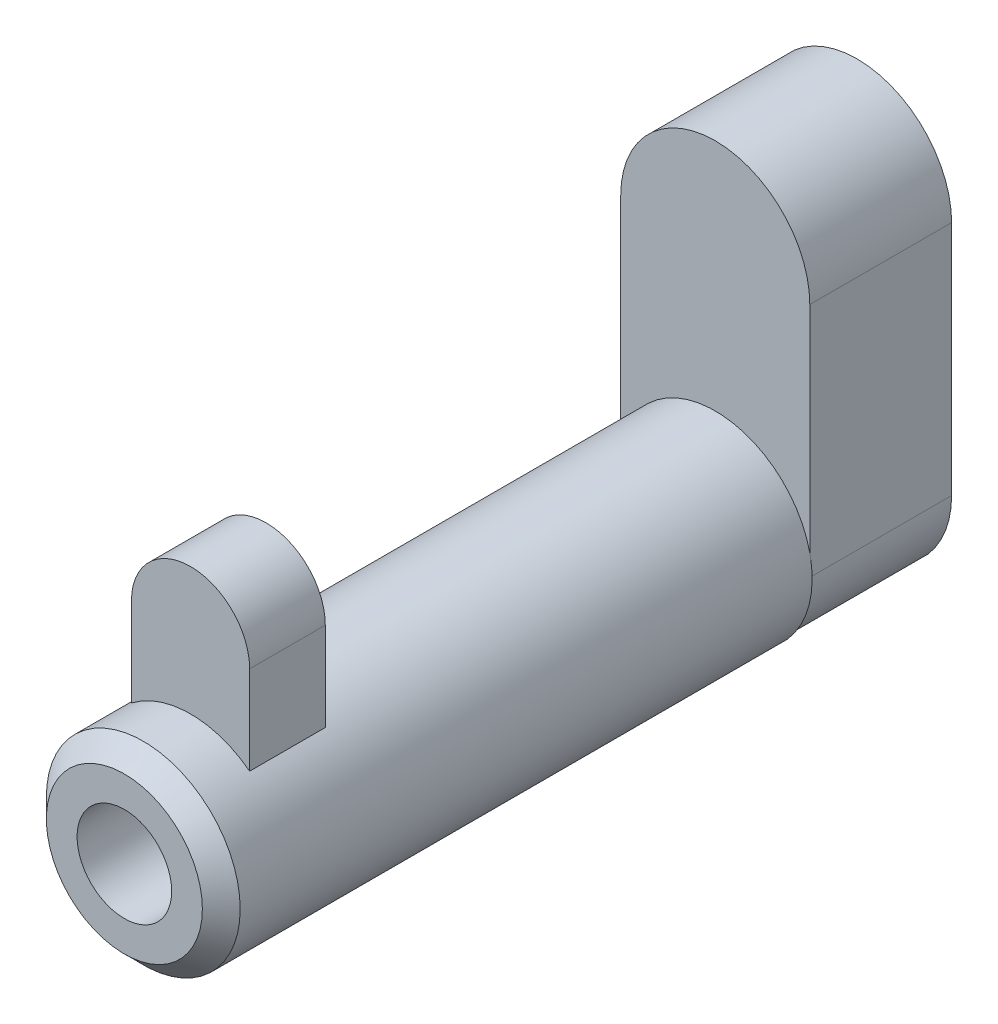
ISO-10303-21;
HEADER;
FILE_DESCRIPTION(('STEP AP214'),'2;1');
FILE_NAME('part.step','',(''),(''),'','','');
FILE_SCHEMA(('AUTOMOTIVE_DESIGN { 1 0 10303 214 1 1 1 1 }'));
ENDSEC;
DATA;
#1=APPLICATION_CONTEXT('core data for automotive mechanical design processes');
#2=APPLICATION_PROTOCOL_DEFINITION('international standard','automotive_design',2000,#1);
#3=PRODUCT_CONTEXT('',#1,'mechanical');
#4=PRODUCT('Part','Part','',(#3));
#5=PRODUCT_RELATED_PRODUCT_CATEGORY('part','',(#4));
#6=PRODUCT_DEFINITION_FORMATION('','',#4);
#7=PRODUCT_DEFINITION_CONTEXT('part definition',#1,'design');
#8=PRODUCT_DEFINITION('design','',#6,#7);
#9=PRODUCT_DEFINITION_SHAPE('','',#8);
#10=(LENGTH_UNIT() NAMED_UNIT(*) SI_UNIT(.MILLI.,.METRE.));
#11=(NAMED_UNIT(*) PLANE_ANGLE_UNIT() SI_UNIT($,.RADIAN.));
#12=(NAMED_UNIT(*) SI_UNIT($,.STERADIAN.) SOLID_ANGLE_UNIT());
#13=UNCERTAINTY_MEASURE_WITH_UNIT(LENGTH_MEASURE(1.E-05),#10,'distance_accuracy_value','');
#14=(GEOMETRIC_REPRESENTATION_CONTEXT(3) GLOBAL_UNCERTAINTY_ASSIGNED_CONTEXT((#13)) GLOBAL_UNIT_ASSIGNED_CONTEXT((#10,
#11,#12)) REPRESENTATION_CONTEXT('',''));
#15=CARTESIAN_POINT('',(0.,0.,0.));
#16=DIRECTION('',(0.,0.,1.));
#17=DIRECTION('',(1.,0.,0.));
#18=AXIS2_PLACEMENT_3D('',#15,#16,#17);
#19=CARTESIAN_POINT('',(0.,5.,3.));
#20=DIRECTION('',(0.,0.,-1.));
#21=DIRECTION('',(-1.,0.,0.));
#22=AXIS2_PLACEMENT_3D('',#19,#20,#21);
#23=CYLINDRICAL_SURFACE('',#22,2.);
#24=CARTESIAN_POINT('',(0.,5.,0.));
#25=DIRECTION('',(0.,0.,1.));
#26=DIRECTION('',(1.,0.,0.));
#27=AXIS2_PLACEMENT_3D('',#24,#25,#26);
#28=CIRCLE('',#27,2.);
#29=CARTESIAN_POINT('',(2.,5.,0.));
#30=VERTEX_POINT('',#29);
#31=CARTESIAN_POINT('',(-2.,5.,0.));
#32=VERTEX_POINT('',#31);
#33=EDGE_CURVE('E150',#30,#32,#28,.T.);
#34=ORIENTED_EDGE('',*,*,#33,.T.);
#35=DIRECTION('',(0.,0.,-1.));
#36=VECTOR('',#35,1.);
#37=CARTESIAN_POINT('',(-2.,5.,3.));
#38=LINE('',#37,#36);
#39=CARTESIAN_POINT('',(-2.,5.,3.));
#40=VERTEX_POINT('',#39);
#41=EDGE_CURVE('E181',#40,#32,#38,.T.);
#42=ORIENTED_EDGE('',*,*,#41,.F.);
#43=CARTESIAN_POINT('',(0.,5.,3.));
#44=DIRECTION('',(0.,0.,1.));
#45=DIRECTION('',(1.,0.,0.));
#46=AXIS2_PLACEMENT_3D('',#43,#44,#45);
#47=CIRCLE('',#46,2.);
#48=CARTESIAN_POINT('',(2.,5.,3.));
#49=VERTEX_POINT('',#48);
#50=EDGE_CURVE('E151',#49,#40,#47,.T.);
#51=ORIENTED_EDGE('',*,*,#50,.F.);
#52=DIRECTION('',(0.,0.,-1.));
#53=VECTOR('',#52,1.);
#54=CARTESIAN_POINT('',(2.,5.,3.));
#55=LINE('',#54,#53);
#56=EDGE_CURVE('E165',#49,#30,#55,.T.);
#57=ORIENTED_EDGE('',*,*,#56,.T.);
#58=EDGE_LOOP('',(#34,#42,#51,#57));
#59=FACE_BOUND('',#58,.T.);
#60=ADVANCED_FACE('F37',(#59),#23,.T.);
#61=CARTESIAN_POINT('',(-2.,5.,3.));
#62=DIRECTION('',(1.,0.,0.));
#63=DIRECTION('',(0.,1.,0.));
#64=AXIS2_PLACEMENT_3D('',#61,#62,#63);
#65=PLANE('',#64);
#66=DIRECTION('',(0.,-1.,0.));
#67=VECTOR('',#66,1.);
#68=CARTESIAN_POINT('',(-2.,5.,0.));
#69=LINE('',#68,#67);
#70=CARTESIAN_POINT('',(-2.,0.,0.));
#71=VERTEX_POINT('',#70);
#72=EDGE_CURVE('E168',#32,#71,#69,.T.);
#73=ORIENTED_EDGE('',*,*,#72,.T.);
#74=DIRECTION('',(0.,0.,-1.));
#75=VECTOR('',#74,1.);
#76=CARTESIAN_POINT('',(-2.,0.,3.));
#77=LINE('',#76,#75);
#78=CARTESIAN_POINT('',(-2.,0.,3.));
#79=VERTEX_POINT('',#78);
#80=EDGE_CURVE('E179',#79,#71,#77,.T.);
#81=ORIENTED_EDGE('',*,*,#80,.F.);
#82=DIRECTION('',(0.,-1.,0.));
#83=VECTOR('',#82,1.);
#84=CARTESIAN_POINT('',(-2.,5.,3.));
#85=LINE('',#84,#83);
#86=CARTESIAN_POINT('',(-2.,0.450000000000007,3.));
#87=VERTEX_POINT('',#86);
#88=EDGE_CURVE('E154',#87,#79,#85,.T.);
#89=ORIENTED_EDGE('',*,*,#88,.F.);
#90=EDGE_CURVE('E156',#40,#87,#85,.T.);
#91=ORIENTED_EDGE('',*,*,#90,.F.);
#92=ORIENTED_EDGE('',*,*,#41,.T.);
#93=EDGE_LOOP('',(#73,#81,#89,#91,#92));
#94=FACE_BOUND('',#93,.T.);
#95=ADVANCED_FACE('F200',(#94),#65,.F.);
#96=CARTESIAN_POINT('',(0.,0.,3.));
#97=DIRECTION('',(0.,0.,-1.));
#98=DIRECTION('',(-1.,0.,0.));
#99=AXIS2_PLACEMENT_3D('',#96,#97,#98);
#100=CYLINDRICAL_SURFACE('',#99,2.);
#101=CARTESIAN_POINT('',(0.,0.,0.));
#102=DIRECTION('',(0.,0.,-1.));
#103=DIRECTION('',(-1.,0.,0.));
#104=AXIS2_PLACEMENT_3D('',#101,#102,#103);
#105=CIRCLE('',#104,2.);
#106=CARTESIAN_POINT('',(2.,0.,0.));
#107=VERTEX_POINT('',#106);
#108=EDGE_CURVE('E171',#107,#71,#105,.T.);
#109=ORIENTED_EDGE('',*,*,#108,.F.);
#110=DIRECTION('',(0.,0.,-1.));
#111=VECTOR('',#110,1.);
#112=CARTESIAN_POINT('',(2.,0.,3.));
#113=LINE('',#112,#111);
#114=CARTESIAN_POINT('',(2.,0.,3.));
#115=VERTEX_POINT('',#114);
#116=EDGE_CURVE('E177',#115,#107,#113,.T.);
#117=ORIENTED_EDGE('',*,*,#116,.F.);
#118=CARTESIAN_POINT('',(0.,0.,3.));
#119=DIRECTION('',(0.,0.,-1.));
#120=DIRECTION('',(-1.,0.,0.));
#121=AXIS2_PLACEMENT_3D('',#118,#119,#120);
#122=CIRCLE('',#121,2.);
#123=EDGE_CURVE('E158',#115,#79,#122,.T.);
#124=ORIENTED_EDGE('',*,*,#123,.T.);
#125=ORIENTED_EDGE('',*,*,#80,.T.);
#126=EDGE_LOOP('',(#109,#117,#124,#125));
#127=FACE_BOUND('',#126,.T.);
#128=ADVANCED_FACE('F205',(#127),#100,.T.);
#129=CARTESIAN_POINT('',(2.,0.,3.));
#130=DIRECTION('',(-1.,0.,0.));
#131=DIRECTION('',(0.,-1.,0.));
#132=AXIS2_PLACEMENT_3D('',#129,#130,#131);
#133=PLANE('',#132);
#134=DIRECTION('',(0.,1.,0.));
#135=VECTOR('',#134,1.);
#136=CARTESIAN_POINT('',(2.,0.,0.));
#137=LINE('',#136,#135);
#138=EDGE_CURVE('E155',#107,#30,#137,.T.);
#139=ORIENTED_EDGE('',*,*,#138,.T.);
#140=ORIENTED_EDGE('',*,*,#56,.F.);
#141=DIRECTION('',(0.,1.,0.));
#142=VECTOR('',#141,1.);
#143=CARTESIAN_POINT('',(2.,0.,3.));
#144=LINE('',#143,#142);
#145=CARTESIAN_POINT('',(2.,0.450000000000011,3.));
#146=VERTEX_POINT('',#145);
#147=EDGE_CURVE('E161',#146,#49,#144,.T.);
#148=ORIENTED_EDGE('',*,*,#147,.F.);
#149=EDGE_CURVE('E162',#115,#146,#144,.T.);
#150=ORIENTED_EDGE('',*,*,#149,.F.);
#151=ORIENTED_EDGE('',*,*,#116,.T.);
#152=EDGE_LOOP('',(#139,#140,#148,#150,#151));
#153=FACE_BOUND('',#152,.T.);
#154=ADVANCED_FACE('F211',(#153),#133,.F.);
#155=CARTESIAN_POINT('',(0.,5.,3.));
#156=DIRECTION('',(0.,0.,1.));
#157=DIRECTION('',(1.,0.,0.));
#158=AXIS2_PLACEMENT_3D('',#155,#156,#157);
#159=PLANE('',#158);
#160=CARTESIAN_POINT('',(0.,0.,3.));
#161=DIRECTION('',(0.,0.,1.));
#162=DIRECTION('',(1.,0.,0.));
#163=AXIS2_PLACEMENT_3D('',#160,#161,#162);
#164=CIRCLE('',#163,2.05);
#165=EDGE_CURVE('E147',#146,#87,#164,.T.);
#166=ORIENTED_EDGE('',*,*,#165,.F.);
#167=ORIENTED_EDGE('',*,*,#147,.T.);
#168=ORIENTED_EDGE('',*,*,#50,.T.);
#169=ORIENTED_EDGE('',*,*,#90,.T.);
#170=EDGE_LOOP('',(#166,#167,#168,#169));
#171=FACE_BOUND('',#170,.T.);
#172=ADVANCED_FACE('F215',(#171),#159,.T.);
#173=CARTESIAN_POINT('',(0.,5.,0.));
#174=DIRECTION('',(0.,0.,1.));
#175=DIRECTION('',(1.,0.,0.));
#176=AXIS2_PLACEMENT_3D('',#173,#174,#175);
#177=PLANE('',#176);
#178=CARTESIAN_POINT('',(0.,0.,0.));
#179=DIRECTION('',(0.,0.,1.));
#180=DIRECTION('',(1.,0.,0.));
#181=AXIS2_PLACEMENT_3D('',#178,#179,#180);
#182=CIRCLE('',#181,1.);
#183=CARTESIAN_POINT('',(1.,0.,0.));
#184=VERTEX_POINT('',#183);
#185=EDGE_CURVE('E138',#184,#184,#182,.F.);
#186=ORIENTED_EDGE('',*,*,#185,.F.);
#187=EDGE_LOOP('',(#186));
#188=FACE_BOUND('',#187,.T.);
#189=ORIENTED_EDGE('',*,*,#33,.F.);
#190=ORIENTED_EDGE('',*,*,#138,.F.);
#191=ORIENTED_EDGE('',*,*,#108,.T.);
#192=ORIENTED_EDGE('',*,*,#72,.F.);
#193=EDGE_LOOP('',(#189,#190,#191,#192));
#194=FACE_BOUND('',#193,.T.);
#195=ADVANCED_FACE('F217',(#188,#194),#177,.F.);
#196=CARTESIAN_POINT('',(0.,0.,3.));
#197=DIRECTION('',(0.,0.,1.));
#198=DIRECTION('',(1.,0.,0.));
#199=AXIS2_PLACEMENT_3D('',#196,#197,#198);
#200=PLANE('',#199);
#201=EDGE_CURVE('E117',#87,#146,#164,.T.);
#202=ORIENTED_EDGE('',*,*,#201,.F.);
#203=ORIENTED_EDGE('',*,*,#88,.T.);
#204=ORIENTED_EDGE('',*,*,#123,.F.);
#205=ORIENTED_EDGE('',*,*,#149,.T.);
#206=EDGE_LOOP('',(#202,#203,#204,#205));
#207=FACE_BOUND('',#206,.T.);
#208=ADVANCED_FACE('F220',(#207),#200,.F.);
#209=CARTESIAN_POINT('',(0.,0.,15.5));
#210=DIRECTION('',(0.,0.,-1.));
#211=DIRECTION('',(-1.,0.,0.));
#212=AXIS2_PLACEMENT_3D('',#209,#210,#211);
#213=CYLINDRICAL_SURFACE('',#212,2.05);
#214=CARTESIAN_POINT('',(0.,0.,15.1));
#215=DIRECTION('',(0.,0.,1.));
#216=DIRECTION('',(1.,0.,0.));
#217=AXIS2_PLACEMENT_3D('',#214,#215,#216);
#218=CIRCLE('',#217,2.05);
#219=CARTESIAN_POINT('',(2.05,0.,15.1));
#220=VERTEX_POINT('',#219);
#221=EDGE_CURVE('E11',#220,#220,#218,.F.);
#222=ORIENTED_EDGE('',*,*,#221,.T.);
#223=EDGE_LOOP('',(#222));
#224=FACE_BOUND('',#223,.T.);
#225=DIRECTION('',(0.,0.,-1.));
#226=VECTOR('',#225,1.);
#227=CARTESIAN_POINT('',(1.25,1.6248076809272,14.1));
#228=LINE('',#227,#226);
#229=CARTESIAN_POINT('',(1.25,1.6248076809272,14.1));
#230=VERTEX_POINT('',#229);
#231=CARTESIAN_POINT('',(1.25,1.6248076809272,12.5));
#232=VERTEX_POINT('',#231);
#233=EDGE_CURVE('E58',#230,#232,#228,.T.);
#234=ORIENTED_EDGE('',*,*,#233,.F.);
#235=CARTESIAN_POINT('',(0.,0.,14.1));
#236=DIRECTION('',(0.,0.,1.));
#237=DIRECTION('',(1.,0.,0.));
#238=AXIS2_PLACEMENT_3D('',#235,#236,#237);
#239=CIRCLE('',#238,2.05);
#240=CARTESIAN_POINT('',(-1.25,1.6248076809272,14.1));
#241=VERTEX_POINT('',#240);
#242=EDGE_CURVE('E53',#241,#230,#239,.F.);
#243=ORIENTED_EDGE('',*,*,#242,.F.);
#244=DIRECTION('',(0.,0.,-1.));
#245=VECTOR('',#244,1.);
#246=CARTESIAN_POINT('',(-1.25,1.6248076809272,14.1));
#247=LINE('',#246,#245);
#248=CARTESIAN_POINT('',(-1.25,1.6248076809272,12.5));
#249=VERTEX_POINT('',#248);
#250=EDGE_CURVE('E118',#241,#249,#247,.T.);
#251=ORIENTED_EDGE('',*,*,#250,.T.);
#252=CARTESIAN_POINT('',(0.,0.,12.5));
#253=DIRECTION('',(0.,0.,1.));
#254=DIRECTION('',(1.,0.,0.));
#255=AXIS2_PLACEMENT_3D('',#252,#253,#254);
#256=CIRCLE('',#255,2.05);
#257=EDGE_CURVE('E140',#249,#232,#256,.F.);
#258=ORIENTED_EDGE('',*,*,#257,.T.);
#259=EDGE_LOOP('',(#234,#243,#251,#258));
#260=FACE_BOUND('',#259,.T.);
#261=ORIENTED_EDGE('',*,*,#165,.T.);
#262=ORIENTED_EDGE('',*,*,#201,.T.);
#263=EDGE_LOOP('',(#261,#262));
#264=FACE_BOUND('',#263,.T.);
#265=ADVANCED_FACE('F225',(#224,#260,#264),#213,.T.);
#266=CARTESIAN_POINT('',(0.,0.,15.5));
#267=DIRECTION('',(0.,0.,1.));
#268=DIRECTION('',(1.,0.,0.));
#269=AXIS2_PLACEMENT_3D('',#266,#267,#268);
#270=PLANE('',#269);
#271=CARTESIAN_POINT('',(0.,0.,15.5));
#272=DIRECTION('',(0.,0.,1.));
#273=DIRECTION('',(1.,0.,0.));
#274=AXIS2_PLACEMENT_3D('',#271,#272,#273);
#275=CIRCLE('',#274,1.65);
#276=CARTESIAN_POINT('',(1.65,0.,15.5));
#277=VERTEX_POINT('',#276);
#278=EDGE_CURVE('E46',#277,#277,#275,.T.);
#279=ORIENTED_EDGE('',*,*,#278,.T.);
#280=EDGE_LOOP('',(#279));
#281=FACE_BOUND('',#280,.T.);
#282=CARTESIAN_POINT('',(0.,0.,15.5));
#283=DIRECTION('',(0.,0.,1.));
#284=DIRECTION('',(1.,0.,0.));
#285=AXIS2_PLACEMENT_3D('',#282,#283,#284);
#286=CIRCLE('',#285,1.);
#287=CARTESIAN_POINT('',(1.,0.,15.5));
#288=VERTEX_POINT('',#287);
#289=EDGE_CURVE('E364',#288,#288,#286,.T.);
#290=ORIENTED_EDGE('',*,*,#289,.F.);
#291=EDGE_LOOP('',(#290));
#292=FACE_BOUND('',#291,.T.);
#293=ADVANCED_FACE('F186',(#281,#292),#270,.T.);
#294=CARTESIAN_POINT('',(0.,3.5,14.1));
#295=DIRECTION('',(0.,0.,-1.));
#296=DIRECTION('',(-1.,0.,0.));
#297=AXIS2_PLACEMENT_3D('',#294,#295,#296);
#298=CYLINDRICAL_SURFACE('',#297,1.25);
#299=CARTESIAN_POINT('',(0.,3.5,12.5));
#300=DIRECTION('',(0.,0.,1.));
#301=DIRECTION('',(1.,0.,0.));
#302=AXIS2_PLACEMENT_3D('',#299,#300,#301);
#303=CIRCLE('',#302,1.25);
#304=CARTESIAN_POINT('',(-1.25,3.5,12.5));
#305=VERTEX_POINT('',#304);
#306=CARTESIAN_POINT('',(1.25,3.5,12.5));
#307=VERTEX_POINT('',#306);
#308=EDGE_CURVE('E112',#305,#307,#303,.F.);
#309=ORIENTED_EDGE('',*,*,#308,.F.);
#310=DIRECTION('',(0.,0.,-1.));
#311=VECTOR('',#310,1.);
#312=CARTESIAN_POINT('',(-1.25,3.5,14.1));
#313=LINE('',#312,#311);
#314=CARTESIAN_POINT('',(-1.25,3.5,14.1));
#315=VERTEX_POINT('',#314);
#316=EDGE_CURVE('E107',#315,#305,#313,.T.);
#317=ORIENTED_EDGE('',*,*,#316,.F.);
#318=CARTESIAN_POINT('',(0.,3.5,14.1));
#319=DIRECTION('',(0.,0.,1.));
#320=DIRECTION('',(1.,0.,0.));
#321=AXIS2_PLACEMENT_3D('',#318,#319,#320);
#322=CIRCLE('',#321,1.25);
#323=CARTESIAN_POINT('',(1.25,3.5,14.1));
#324=VERTEX_POINT('',#323);
#325=EDGE_CURVE('E110',#315,#324,#322,.F.);
#326=ORIENTED_EDGE('',*,*,#325,.T.);
#327=DIRECTION('',(0.,0.,-1.));
#328=VECTOR('',#327,1.);
#329=CARTESIAN_POINT('',(1.25,3.5,14.1));
#330=LINE('',#329,#328);
#331=EDGE_CURVE('E135',#324,#307,#330,.T.);
#332=ORIENTED_EDGE('',*,*,#331,.T.);
#333=EDGE_LOOP('',(#309,#317,#326,#332));
#334=FACE_BOUND('',#333,.T.);
#335=ADVANCED_FACE('F109',(#334),#298,.T.);
#336=CARTESIAN_POINT('',(-1.25,0.,14.1));
#337=DIRECTION('',(-1.,0.,0.));
#338=DIRECTION('',(0.,0.,1.));
#339=AXIS2_PLACEMENT_3D('',#336,#337,#338);
#340=PLANE('',#339);
#341=DIRECTION('',(0.,1.,0.));
#342=VECTOR('',#341,1.);
#343=CARTESIAN_POINT('',(-1.25,0.,12.5));
#344=LINE('',#343,#342);
#345=EDGE_CURVE('E137',#249,#305,#344,.T.);
#346=ORIENTED_EDGE('',*,*,#345,.F.);
#347=ORIENTED_EDGE('',*,*,#250,.F.);
#348=DIRECTION('',(0.,1.,0.));
#349=VECTOR('',#348,1.);
#350=CARTESIAN_POINT('',(-1.25,0.,14.1));
#351=LINE('',#350,#349);
#352=EDGE_CURVE('E123',#241,#315,#351,.T.);
#353=ORIENTED_EDGE('',*,*,#352,.T.);
#354=ORIENTED_EDGE('',*,*,#316,.T.);
#355=EDGE_LOOP('',(#346,#347,#353,#354));
#356=FACE_BOUND('',#355,.T.);
#357=ADVANCED_FACE('F129',(#356),#340,.T.);
#358=CARTESIAN_POINT('',(1.25,0.,14.1));
#359=DIRECTION('',(-1.,0.,0.));
#360=DIRECTION('',(0.,0.,1.));
#361=AXIS2_PLACEMENT_3D('',#358,#359,#360);
#362=PLANE('',#361);
#363=DIRECTION('',(0.,1.,0.));
#364=VECTOR('',#363,1.);
#365=CARTESIAN_POINT('',(1.25,0.,12.5));
#366=LINE('',#365,#364);
#367=EDGE_CURVE('E127',#232,#307,#366,.T.);
#368=ORIENTED_EDGE('',*,*,#367,.T.);
#369=ORIENTED_EDGE('',*,*,#331,.F.);
#370=DIRECTION('',(0.,1.,0.));
#371=VECTOR('',#370,1.);
#372=CARTESIAN_POINT('',(1.25,0.,14.1));
#373=LINE('',#372,#371);
#374=EDGE_CURVE('E125',#230,#324,#373,.T.);
#375=ORIENTED_EDGE('',*,*,#374,.F.);
#376=ORIENTED_EDGE('',*,*,#233,.T.);
#377=EDGE_LOOP('',(#368,#369,#375,#376));
#378=FACE_BOUND('',#377,.T.);
#379=ADVANCED_FACE('F238',(#378),#362,.F.);
#380=CARTESIAN_POINT('',(0.,0.,14.1));
#381=DIRECTION('',(0.,0.,1.));
#382=DIRECTION('',(1.,0.,0.));
#383=AXIS2_PLACEMENT_3D('',#380,#381,#382);
#384=PLANE('',#383);
#385=ORIENTED_EDGE('',*,*,#325,.F.);
#386=ORIENTED_EDGE('',*,*,#352,.F.);
#387=ORIENTED_EDGE('',*,*,#242,.T.);
#388=ORIENTED_EDGE('',*,*,#374,.T.);
#389=EDGE_LOOP('',(#385,#386,#387,#388));
#390=FACE_BOUND('',#389,.T.);
#391=ADVANCED_FACE('F122',(#390),#384,.T.);
#392=CARTESIAN_POINT('',(0.,0.,12.5));
#393=DIRECTION('',(0.,0.,1.));
#394=DIRECTION('',(1.,0.,0.));
#395=AXIS2_PLACEMENT_3D('',#392,#393,#394);
#396=PLANE('',#395);
#397=ORIENTED_EDGE('',*,*,#308,.T.);
#398=ORIENTED_EDGE('',*,*,#367,.F.);
#399=ORIENTED_EDGE('',*,*,#257,.F.);
#400=ORIENTED_EDGE('',*,*,#345,.T.);
#401=EDGE_LOOP('',(#397,#398,#399,#400));
#402=FACE_BOUND('',#401,.T.);
#403=ADVANCED_FACE('F195',(#402),#396,.F.);
#404=CARTESIAN_POINT('',(0.,0.,-0.000999999999999265));
#405=DIRECTION('',(0.,0.,1.));
#406=DIRECTION('',(1.,0.,0.));
#407=AXIS2_PLACEMENT_3D('',#404,#405,#406);
#408=CYLINDRICAL_SURFACE('',#407,1.);
#409=ORIENTED_EDGE('',*,*,#289,.T.);
#410=EDGE_LOOP('',(#409));
#411=FACE_BOUND('',#410,.T.);
#412=ORIENTED_EDGE('',*,*,#185,.T.);
#413=EDGE_LOOP('',(#412));
#414=FACE_BOUND('',#413,.T.);
#415=ADVANCED_FACE('F190',(#411,#414),#408,.F.);
#416=CARTESIAN_POINT('',(0.,0.,15.5));
#417=DIRECTION('',(0.,0.,-1.));
#418=DIRECTION('',(-1.,0.,0.));
#419=AXIS2_PLACEMENT_3D('',#416,#417,#418);
#420=CONICAL_SURFACE('',#419,1.65,0.785398163397442);
#421=ORIENTED_EDGE('',*,*,#221,.F.);
#422=EDGE_LOOP('',(#421));
#423=FACE_BOUND('',#422,.T.);
#424=ORIENTED_EDGE('',*,*,#278,.F.);
#425=EDGE_LOOP('',(#424));
#426=FACE_BOUND('',#425,.T.);
#427=ADVANCED_FACE('F40',(#423,#426),#420,.T.);
#428=CLOSED_SHELL('',(#60,#95,#128,#154,#172,#195,#208,#265,#293,#335,#357,#379,#391,#403,#415,#427));
#429=MANIFOLD_SOLID_BREP('B2',#428);
#430=ADVANCED_BREP_SHAPE_REPRESENTATION('',(#18,#429),#14);
#431=SHAPE_DEFINITION_REPRESENTATION(#9,#430);
ENDSEC;
END-ISO-10303-21;
